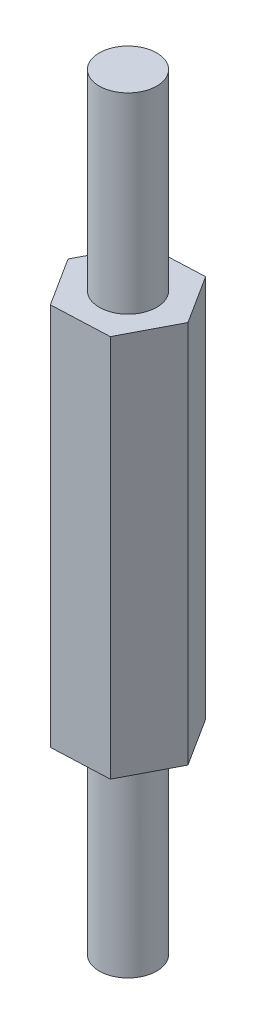
ISO-10303-21;
HEADER;
FILE_DESCRIPTION(('STEP AP214'),'2;1');
FILE_NAME('part.step','',(''),(''),'','','');
FILE_SCHEMA(('AUTOMOTIVE_DESIGN { 1 0 10303 214 1 1 1 1 }'));
ENDSEC;
DATA;
#1=APPLICATION_CONTEXT('core data for automotive mechanical design processes');
#2=APPLICATION_PROTOCOL_DEFINITION('international standard','automotive_design',2000,#1);
#3=PRODUCT_CONTEXT('',#1,'mechanical');
#4=PRODUCT('Part','Part','',(#3));
#5=PRODUCT_RELATED_PRODUCT_CATEGORY('part','',(#4));
#6=PRODUCT_DEFINITION_FORMATION('','',#4);
#7=PRODUCT_DEFINITION_CONTEXT('part definition',#1,'design');
#8=PRODUCT_DEFINITION('design','',#6,#7);
#9=PRODUCT_DEFINITION_SHAPE('','',#8);
#10=(LENGTH_UNIT() NAMED_UNIT(*) SI_UNIT(.MILLI.,.METRE.));
#11=(NAMED_UNIT(*) PLANE_ANGLE_UNIT() SI_UNIT($,.RADIAN.));
#12=(NAMED_UNIT(*) SI_UNIT($,.STERADIAN.) SOLID_ANGLE_UNIT());
#13=UNCERTAINTY_MEASURE_WITH_UNIT(LENGTH_MEASURE(1.E-05),#10,'distance_accuracy_value','');
#14=(GEOMETRIC_REPRESENTATION_CONTEXT(3) GLOBAL_UNCERTAINTY_ASSIGNED_CONTEXT((#13)) GLOBAL_UNIT_ASSIGNED_CONTEXT((#10,
#11,#12)) REPRESENTATION_CONTEXT('',''));
#15=CARTESIAN_POINT('',(0.,0.,0.));
#16=DIRECTION('',(0.,0.,1.));
#17=DIRECTION('',(1.,0.,0.));
#18=AXIS2_PLACEMENT_3D('',#15,#16,#17);
#19=CARTESIAN_POINT('',(0.,0.,0.));
#20=DIRECTION('',(0.,1.,0.));
#21=DIRECTION('',(0.,0.,1.));
#22=AXIS2_PLACEMENT_3D('',#19,#20,#21);
#23=PLANE('',#22);
#24=DIRECTION('',(-0.536521996042108,0.,-0.843886335807727));
#25=VECTOR('',#24,1.);
#26=CARTESIAN_POINT('',(3.,0.,-0.12821246048624));
#27=LINE('',#26,#25);
#28=CARTESIAN_POINT('',(3.,0.,-0.12821246048624));
#29=VERTEX_POINT('',#28);
#30=CARTESIAN_POINT('',(1.38896475213721,0.,-2.66218244159644));
#31=VERTEX_POINT('',#30);
#32=EDGE_CURVE('E119',#29,#31,#27,.T.);
#33=ORIENTED_EDGE('',*,*,#32,.F.);
#34=DIRECTION('',(0.462566006695003,0.,-0.886584846165463));
#35=VECTOR('',#34,1.);
#36=CARTESIAN_POINT('',(1.61103524786279,0.,2.5339699811102));
#37=LINE('',#36,#35);
#38=CARTESIAN_POINT('',(1.61103524786279,0.,2.5339699811102));
#39=VERTEX_POINT('',#38);
#40=EDGE_CURVE('E78',#39,#29,#37,.T.);
#41=ORIENTED_EDGE('',*,*,#40,.F.);
#42=DIRECTION('',(0.999088002737111,0.,-0.0426985103577362));
#43=VECTOR('',#42,1.);
#44=CARTESIAN_POINT('',(-1.38896475213721,0.,2.66218244159644));
#45=LINE('',#44,#43);
#46=CARTESIAN_POINT('',(-1.38896475213721,0.,2.66218244159644));
#47=VERTEX_POINT('',#46);
#48=EDGE_CURVE('E72',#47,#39,#45,.T.);
#49=ORIENTED_EDGE('',*,*,#48,.F.);
#50=DIRECTION('',(0.536521996042108,0.,0.843886335807727));
#51=VECTOR('',#50,1.);
#52=CARTESIAN_POINT('',(-3.,0.,0.12821246048624));
#53=LINE('',#52,#51);
#54=CARTESIAN_POINT('',(-3.,0.,0.12821246048624));
#55=VERTEX_POINT('',#54);
#56=EDGE_CURVE('E109',#55,#47,#53,.T.);
#57=ORIENTED_EDGE('',*,*,#56,.F.);
#58=DIRECTION('',(-0.462566006695003,0.,0.886584846165463));
#59=VECTOR('',#58,1.);
#60=CARTESIAN_POINT('',(-1.61103524786279,0.,-2.5339699811102));
#61=LINE('',#60,#59);
#62=CARTESIAN_POINT('',(-1.61103524786279,0.,-2.5339699811102));
#63=VERTEX_POINT('',#62);
#64=EDGE_CURVE('E125',#63,#55,#61,.T.);
#65=ORIENTED_EDGE('',*,*,#64,.F.);
#66=DIRECTION('',(-0.999088002737111,0.,0.0426985103577361));
#67=VECTOR('',#66,1.);
#68=CARTESIAN_POINT('',(1.38896475213721,0.,-2.66218244159644));
#69=LINE('',#68,#67);
#70=EDGE_CURVE('E122',#31,#63,#69,.T.);
#71=ORIENTED_EDGE('',*,*,#70,.F.);
#72=EDGE_LOOP('',(#33,#41,#49,#57,#65,#71));
#73=FACE_BOUND('',#72,.T.);
#74=CARTESIAN_POINT('',(0.,0.,0.));
#75=DIRECTION('',(0.,1.,0.));
#76=DIRECTION('',(0.,0.,1.));
#77=AXIS2_PLACEMENT_3D('',#74,#75,#76);
#78=CIRCLE('',#77,1.5);
#79=CARTESIAN_POINT('',(0.,0.,1.5));
#80=VERTEX_POINT('',#79);
#81=EDGE_CURVE('E11',#80,#80,#78,.F.);
#82=ORIENTED_EDGE('',*,*,#81,.F.);
#83=EDGE_LOOP('',(#82));
#84=FACE_BOUND('',#83,.T.);
#85=ADVANCED_FACE('F32',(#73,#84),#23,.F.);
#86=CARTESIAN_POINT('',(0.,20.,0.));
#87=DIRECTION('',(0.,1.,0.));
#88=DIRECTION('',(0.,0.,1.));
#89=AXIS2_PLACEMENT_3D('',#86,#87,#88);
#90=PLANE('',#89);
#91=DIRECTION('',(-0.536521996042108,0.,-0.843886335807727));
#92=VECTOR('',#91,1.);
#93=CARTESIAN_POINT('',(3.,20.,-0.12821246048624));
#94=LINE('',#93,#92);
#95=CARTESIAN_POINT('',(3.,20.,-0.12821246048624));
#96=VERTEX_POINT('',#95);
#97=CARTESIAN_POINT('',(1.38896475213721,20.,-2.66218244159644));
#98=VERTEX_POINT('',#97);
#99=EDGE_CURVE('E130',#96,#98,#94,.T.);
#100=ORIENTED_EDGE('',*,*,#99,.T.);
#101=DIRECTION('',(-0.999088002737111,0.,0.0426985103577361));
#102=VECTOR('',#101,1.);
#103=CARTESIAN_POINT('',(1.38896475213721,20.,-2.66218244159644));
#104=LINE('',#103,#102);
#105=CARTESIAN_POINT('',(-1.61103524786279,20.,-2.5339699811102));
#106=VERTEX_POINT('',#105);
#107=EDGE_CURVE('E87',#98,#106,#104,.T.);
#108=ORIENTED_EDGE('',*,*,#107,.T.);
#109=DIRECTION('',(-0.462566006695003,0.,0.886584846165463));
#110=VECTOR('',#109,1.);
#111=CARTESIAN_POINT('',(-1.61103524786279,20.,-2.5339699811102));
#112=LINE('',#111,#110);
#113=CARTESIAN_POINT('',(-3.,20.,0.12821246048624));
#114=VERTEX_POINT('',#113);
#115=EDGE_CURVE('E101',#106,#114,#112,.T.);
#116=ORIENTED_EDGE('',*,*,#115,.T.);
#117=DIRECTION('',(0.536521996042108,0.,0.843886335807727));
#118=VECTOR('',#117,1.);
#119=CARTESIAN_POINT('',(-3.,20.,0.12821246048624));
#120=LINE('',#119,#118);
#121=CARTESIAN_POINT('',(-1.38896475213721,20.,2.66218244159644));
#122=VERTEX_POINT('',#121);
#123=EDGE_CURVE('E94',#114,#122,#120,.T.);
#124=ORIENTED_EDGE('',*,*,#123,.T.);
#125=DIRECTION('',(0.999088002737111,0.,-0.0426985103577362));
#126=VECTOR('',#125,1.);
#127=CARTESIAN_POINT('',(-1.38896475213721,20.,2.66218244159644));
#128=LINE('',#127,#126);
#129=CARTESIAN_POINT('',(1.61103524786279,20.,2.5339699811102));
#130=VERTEX_POINT('',#129);
#131=EDGE_CURVE('E99',#122,#130,#128,.T.);
#132=ORIENTED_EDGE('',*,*,#131,.T.);
#133=DIRECTION('',(0.462566006695003,0.,-0.886584846165463));
#134=VECTOR('',#133,1.);
#135=CARTESIAN_POINT('',(1.61103524786279,20.,2.5339699811102));
#136=LINE('',#135,#134);
#137=EDGE_CURVE('E49',#130,#96,#136,.T.);
#138=ORIENTED_EDGE('',*,*,#137,.T.);
#139=EDGE_LOOP('',(#100,#108,#116,#124,#132,#138));
#140=FACE_BOUND('',#139,.T.);
#141=CARTESIAN_POINT('',(0.,20.,0.));
#142=DIRECTION('',(0.,1.,0.));
#143=DIRECTION('',(0.,0.,1.));
#144=AXIS2_PLACEMENT_3D('',#141,#142,#143);
#145=CIRCLE('',#144,1.5);
#146=CARTESIAN_POINT('',(0.,20.,1.5));
#147=VERTEX_POINT('',#146);
#148=EDGE_CURVE('E149',#147,#147,#145,.T.);
#149=ORIENTED_EDGE('',*,*,#148,.F.);
#150=EDGE_LOOP('',(#149));
#151=FACE_BOUND('',#150,.T.);
#152=ADVANCED_FACE('F96',(#140,#151),#90,.T.);
#153=CARTESIAN_POINT('',(3.,20.,-0.12821246048624));
#154=DIRECTION('',(-0.843886335807727,0.,0.536521996042108));
#155=DIRECTION('',(0.536521996042108,0.,0.843886335807727));
#156=AXIS2_PLACEMENT_3D('',#153,#154,#155);
#157=PLANE('',#156);
#158=ORIENTED_EDGE('',*,*,#32,.T.);
#159=DIRECTION('',(0.,-1.,0.));
#160=VECTOR('',#159,1.);
#161=CARTESIAN_POINT('',(1.38896475213721,20.,-2.66218244159644));
#162=LINE('',#161,#160);
#163=EDGE_CURVE('E41',#98,#31,#162,.T.);
#164=ORIENTED_EDGE('',*,*,#163,.F.);
#165=ORIENTED_EDGE('',*,*,#99,.F.);
#166=DIRECTION('',(0.,-1.,0.));
#167=VECTOR('',#166,1.);
#168=CARTESIAN_POINT('',(3.,20.,-0.12821246048624));
#169=LINE('',#168,#167);
#170=EDGE_CURVE('E115',#96,#29,#169,.T.);
#171=ORIENTED_EDGE('',*,*,#170,.T.);
#172=EDGE_LOOP('',(#158,#164,#165,#171));
#173=FACE_BOUND('',#172,.T.);
#174=ADVANCED_FACE('F34',(#173),#157,.F.);
#175=CARTESIAN_POINT('',(1.38896475213721,20.,-2.66218244159644));
#176=DIRECTION('',(0.0426985103577361,0.,0.999088002737112));
#177=DIRECTION('',(0.999088002737112,0.,-0.0426985103577361));
#178=AXIS2_PLACEMENT_3D('',#175,#176,#177);
#179=PLANE('',#178);
#180=ORIENTED_EDGE('',*,*,#70,.T.);
#181=DIRECTION('',(0.,-1.,0.));
#182=VECTOR('',#181,1.);
#183=CARTESIAN_POINT('',(-1.61103524786279,20.,-2.5339699811102));
#184=LINE('',#183,#182);
#185=EDGE_CURVE('E134',#106,#63,#184,.T.);
#186=ORIENTED_EDGE('',*,*,#185,.F.);
#187=ORIENTED_EDGE('',*,*,#107,.F.);
#188=ORIENTED_EDGE('',*,*,#163,.T.);
#189=EDGE_LOOP('',(#180,#186,#187,#188));
#190=FACE_BOUND('',#189,.T.);
#191=ADVANCED_FACE('F137',(#190),#179,.F.);
#192=CARTESIAN_POINT('',(-1.61103524786279,20.,-2.5339699811102));
#193=DIRECTION('',(0.886584846165463,0.,0.462566006695003));
#194=DIRECTION('',(0.462566006695003,0.,-0.886584846165463));
#195=AXIS2_PLACEMENT_3D('',#192,#193,#194);
#196=PLANE('',#195);
#197=ORIENTED_EDGE('',*,*,#64,.T.);
#198=DIRECTION('',(0.,-1.,0.));
#199=VECTOR('',#198,1.);
#200=CARTESIAN_POINT('',(-3.,20.,0.12821246048624));
#201=LINE('',#200,#199);
#202=EDGE_CURVE('E110',#114,#55,#201,.T.);
#203=ORIENTED_EDGE('',*,*,#202,.F.);
#204=ORIENTED_EDGE('',*,*,#115,.F.);
#205=ORIENTED_EDGE('',*,*,#185,.T.);
#206=EDGE_LOOP('',(#197,#203,#204,#205));
#207=FACE_BOUND('',#206,.T.);
#208=ADVANCED_FACE('F145',(#207),#196,.F.);
#209=CARTESIAN_POINT('',(-3.,20.,0.12821246048624));
#210=DIRECTION('',(0.843886335807727,0.,-0.536521996042108));
#211=DIRECTION('',(-0.536521996042108,0.,-0.843886335807727));
#212=AXIS2_PLACEMENT_3D('',#209,#210,#211);
#213=PLANE('',#212);
#214=ORIENTED_EDGE('',*,*,#56,.T.);
#215=DIRECTION('',(0.,-1.,0.));
#216=VECTOR('',#215,1.);
#217=CARTESIAN_POINT('',(-1.38896475213721,20.,2.66218244159644));
#218=LINE('',#217,#216);
#219=EDGE_CURVE('E106',#122,#47,#218,.T.);
#220=ORIENTED_EDGE('',*,*,#219,.F.);
#221=ORIENTED_EDGE('',*,*,#123,.F.);
#222=ORIENTED_EDGE('',*,*,#202,.T.);
#223=EDGE_LOOP('',(#214,#220,#221,#222));
#224=FACE_BOUND('',#223,.T.);
#225=ADVANCED_FACE('F107',(#224),#213,.F.);
#226=CARTESIAN_POINT('',(-1.38896475213721,20.,2.66218244159644));
#227=DIRECTION('',(-0.0426985103577362,0.,-0.999088002737111));
#228=DIRECTION('',(-0.999088002737111,0.,0.0426985103577362));
#229=AXIS2_PLACEMENT_3D('',#226,#227,#228);
#230=PLANE('',#229);
#231=ORIENTED_EDGE('',*,*,#48,.T.);
#232=DIRECTION('',(0.,-1.,0.));
#233=VECTOR('',#232,1.);
#234=CARTESIAN_POINT('',(1.61103524786279,20.,2.5339699811102));
#235=LINE('',#234,#233);
#236=EDGE_CURVE('E111',#130,#39,#235,.T.);
#237=ORIENTED_EDGE('',*,*,#236,.F.);
#238=ORIENTED_EDGE('',*,*,#131,.F.);
#239=ORIENTED_EDGE('',*,*,#219,.T.);
#240=EDGE_LOOP('',(#231,#237,#238,#239));
#241=FACE_BOUND('',#240,.T.);
#242=ADVANCED_FACE('F113',(#241),#230,.F.);
#243=CARTESIAN_POINT('',(1.61103524786279,20.,2.5339699811102));
#244=DIRECTION('',(-0.886584846165463,0.,-0.462566006695003));
#245=DIRECTION('',(-0.462566006695003,0.,0.886584846165463));
#246=AXIS2_PLACEMENT_3D('',#243,#244,#245);
#247=PLANE('',#246);
#248=ORIENTED_EDGE('',*,*,#40,.T.);
#249=ORIENTED_EDGE('',*,*,#170,.F.);
#250=ORIENTED_EDGE('',*,*,#137,.F.);
#251=ORIENTED_EDGE('',*,*,#236,.T.);
#252=EDGE_LOOP('',(#248,#249,#250,#251));
#253=FACE_BOUND('',#252,.T.);
#254=ADVANCED_FACE('F174',(#253),#247,.F.);
#255=CARTESIAN_POINT('',(0.,30.,0.));
#256=DIRECTION('',(0.,-1.,0.));
#257=DIRECTION('',(0.,0.,-1.));
#258=AXIS2_PLACEMENT_3D('',#255,#256,#257);
#259=CYLINDRICAL_SURFACE('',#258,1.5);
#260=CARTESIAN_POINT('',(0.,30.,0.));
#261=DIRECTION('',(0.,1.,0.));
#262=DIRECTION('',(0.,0.,1.));
#263=AXIS2_PLACEMENT_3D('',#260,#261,#262);
#264=CIRCLE('',#263,1.5);
#265=CARTESIAN_POINT('',(0.,30.,1.5));
#266=VERTEX_POINT('',#265);
#267=EDGE_CURVE('E123',#266,#266,#264,.T.);
#268=ORIENTED_EDGE('',*,*,#267,.F.);
#269=EDGE_LOOP('',(#268));
#270=FACE_BOUND('',#269,.T.);
#271=ORIENTED_EDGE('',*,*,#148,.T.);
#272=EDGE_LOOP('',(#271));
#273=FACE_BOUND('',#272,.T.);
#274=ADVANCED_FACE('F177',(#270,#273),#259,.T.);
#275=CARTESIAN_POINT('',(0.,30.,0.));
#276=DIRECTION('',(0.,1.,0.));
#277=DIRECTION('',(0.,0.,1.));
#278=AXIS2_PLACEMENT_3D('',#275,#276,#277);
#279=PLANE('',#278);
#280=ORIENTED_EDGE('',*,*,#267,.T.);
#281=EDGE_LOOP('',(#280));
#282=FACE_BOUND('',#281,.T.);
#283=ADVANCED_FACE('F163',(#282),#279,.T.);
#284=CARTESIAN_POINT('',(0.,-10.,0.));
#285=DIRECTION('',(0.,1.,0.));
#286=DIRECTION('',(0.,0.,1.));
#287=AXIS2_PLACEMENT_3D('',#284,#285,#286);
#288=CYLINDRICAL_SURFACE('',#287,1.5);
#289=CARTESIAN_POINT('',(0.,-10.,0.));
#290=DIRECTION('',(0.,-1.,0.));
#291=DIRECTION('',(0.,0.,-1.));
#292=AXIS2_PLACEMENT_3D('',#289,#290,#291);
#293=CIRCLE('',#292,1.5);
#294=CARTESIAN_POINT('',(0.,-10.,-1.5));
#295=VERTEX_POINT('',#294);
#296=EDGE_CURVE('E152',#295,#295,#293,.T.);
#297=ORIENTED_EDGE('',*,*,#296,.F.);
#298=EDGE_LOOP('',(#297));
#299=FACE_BOUND('',#298,.T.);
#300=ORIENTED_EDGE('',*,*,#81,.T.);
#301=EDGE_LOOP('',(#300));
#302=FACE_BOUND('',#301,.T.);
#303=ADVANCED_FACE('F160',(#299,#302),#288,.T.);
#304=CARTESIAN_POINT('',(0.,-10.,0.));
#305=DIRECTION('',(0.,-1.,0.));
#306=DIRECTION('',(0.,0.,-1.));
#307=AXIS2_PLACEMENT_3D('',#304,#305,#306);
#308=PLANE('',#307);
#309=ORIENTED_EDGE('',*,*,#296,.T.);
#310=EDGE_LOOP('',(#309));
#311=FACE_BOUND('',#310,.T.);
#312=ADVANCED_FACE('F158',(#311),#308,.T.);
#313=CLOSED_SHELL('',(#85,#152,#174,#191,#208,#225,#242,#254,#274,#283,#303,#312));
#314=MANIFOLD_SOLID_BREP('B2',#313);
#315=ADVANCED_BREP_SHAPE_REPRESENTATION('',(#18,#314),#14);
#316=SHAPE_DEFINITION_REPRESENTATION(#9,#315);
ENDSEC;
END-ISO-10303-21;
